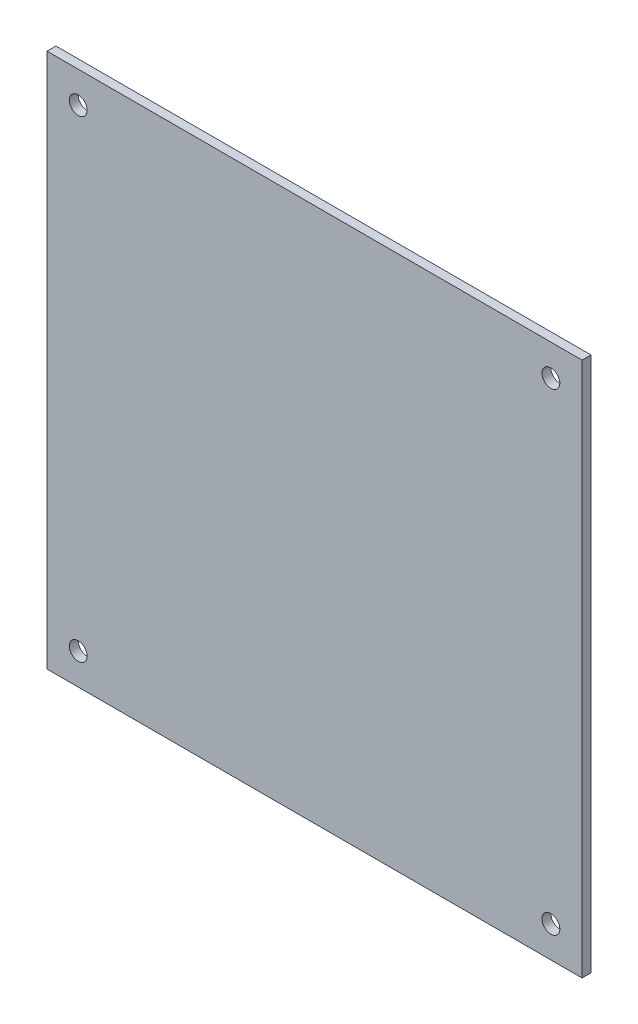
ISO-10303-21;
HEADER;
FILE_DESCRIPTION(('STEP AP214'),'2;1');
FILE_NAME('part.step','',(''),(''),'','','');
FILE_SCHEMA(('AUTOMOTIVE_DESIGN { 1 0 10303 214 1 1 1 1 }'));
ENDSEC;
DATA;
#1=APPLICATION_CONTEXT('core data for automotive mechanical design processes');
#2=APPLICATION_PROTOCOL_DEFINITION('international standard','automotive_design',2000,#1);
#3=PRODUCT_CONTEXT('',#1,'mechanical');
#4=PRODUCT('Part','Part','',(#3));
#5=PRODUCT_RELATED_PRODUCT_CATEGORY('part','',(#4));
#6=PRODUCT_DEFINITION_FORMATION('','',#4);
#7=PRODUCT_DEFINITION_CONTEXT('part definition',#1,'design');
#8=PRODUCT_DEFINITION('design','',#6,#7);
#9=PRODUCT_DEFINITION_SHAPE('','',#8);
#10=(LENGTH_UNIT() NAMED_UNIT(*) SI_UNIT(.MILLI.,.METRE.));
#11=(NAMED_UNIT(*) PLANE_ANGLE_UNIT() SI_UNIT($,.RADIAN.));
#12=(NAMED_UNIT(*) SI_UNIT($,.STERADIAN.) SOLID_ANGLE_UNIT());
#13=UNCERTAINTY_MEASURE_WITH_UNIT(LENGTH_MEASURE(1.E-05),#10,'distance_accuracy_value','');
#14=(GEOMETRIC_REPRESENTATION_CONTEXT(3) GLOBAL_UNCERTAINTY_ASSIGNED_CONTEXT((#13)) GLOBAL_UNIT_ASSIGNED_CONTEXT((#10,
#11,#12)) REPRESENTATION_CONTEXT('',''));
#15=CARTESIAN_POINT('',(0.,0.,0.));
#16=DIRECTION('',(0.,0.,1.));
#17=DIRECTION('',(1.,0.,0.));
#18=AXIS2_PLACEMENT_3D('',#15,#16,#17);
#19=CARTESIAN_POINT('',(0.,0.,4.99999999999999));
#20=DIRECTION('',(0.,0.,-1.));
#21=DIRECTION('',(-1.,0.,0.));
#22=AXIS2_PLACEMENT_3D('',#19,#20,#21);
#23=PLANE('',#22);
#24=DIRECTION('',(0.,1.,0.));
#25=VECTOR('',#24,1.);
#26=CARTESIAN_POINT('',(137.454954954955,81.0135135135139,4.99999999999999));
#27=LINE('',#26,#25);
#28=CARTESIAN_POINT('',(137.454954954955,-218.986486486487,4.99999999999999));
#29=VERTEX_POINT('',#28);
#30=CARTESIAN_POINT('',(137.454954954955,81.0135135135139,4.99999999999999));
#31=VERTEX_POINT('',#30);
#32=EDGE_CURVE('E84',#29,#31,#27,.T.);
#33=ORIENTED_EDGE('',*,*,#32,.T.);
#34=DIRECTION('',(-1.,0.,0.));
#35=VECTOR('',#34,1.);
#36=CARTESIAN_POINT('',(137.454954954955,81.0135135135139,4.99999999999999));
#37=LINE('',#36,#35);
#38=CARTESIAN_POINT('',(-162.545045045045,81.0135135135139,4.99999999999999));
#39=VERTEX_POINT('',#38);
#40=EDGE_CURVE('E79',#31,#39,#37,.T.);
#41=ORIENTED_EDGE('',*,*,#40,.T.);
#42=DIRECTION('',(0.,-1.,0.));
#43=VECTOR('',#42,1.);
#44=CARTESIAN_POINT('',(-162.545045045045,81.0135135135139,4.99999999999999));
#45=LINE('',#44,#43);
#46=CARTESIAN_POINT('',(-162.545045045045,-218.986486486487,4.99999999999999));
#47=VERTEX_POINT('',#46);
#48=EDGE_CURVE('E82',#39,#47,#45,.T.);
#49=ORIENTED_EDGE('',*,*,#48,.T.);
#50=DIRECTION('',(1.,0.,0.));
#51=VECTOR('',#50,1.);
#52=CARTESIAN_POINT('',(137.454954954955,-218.986486486487,4.99999999999999));
#53=LINE('',#52,#51);
#54=EDGE_CURVE('E49',#47,#29,#53,.T.);
#55=ORIENTED_EDGE('',*,*,#54,.T.);
#56=EDGE_LOOP('',(#33,#41,#49,#55));
#57=FACE_BOUND('',#56,.T.);
#58=CARTESIAN_POINT('',(-145.045045045045,63.513513513513,5.));
#59=DIRECTION('',(0.,0.,1.));
#60=DIRECTION('',(1.,0.,0.));
#61=AXIS2_PLACEMENT_3D('',#58,#59,#60);
#62=CIRCLE('',#61,4.99999999999999);
#63=CARTESIAN_POINT('',(-140.045045045045,63.513513513513,5.));
#64=VERTEX_POINT('',#63);
#65=EDGE_CURVE('E99',#64,#64,#62,.T.);
#66=ORIENTED_EDGE('',*,*,#65,.F.);
#67=EDGE_LOOP('',(#66));
#68=FACE_BOUND('',#67,.T.);
#69=CARTESIAN_POINT('',(119.954954954955,63.513513513513,5.));
#70=DIRECTION('',(0.,0.,1.));
#71=DIRECTION('',(1.,0.,0.));
#72=AXIS2_PLACEMENT_3D('',#69,#70,#71);
#73=CIRCLE('',#72,5.00000000000001);
#74=CARTESIAN_POINT('',(124.954954954955,63.513513513513,5.));
#75=VERTEX_POINT('',#74);
#76=EDGE_CURVE('E114',#75,#75,#73,.T.);
#77=ORIENTED_EDGE('',*,*,#76,.F.);
#78=EDGE_LOOP('',(#77));
#79=FACE_BOUND('',#78,.T.);
#80=CARTESIAN_POINT('',(119.954954954955,-201.486486486487,5.));
#81=DIRECTION('',(0.,0.,1.));
#82=DIRECTION('',(1.,0.,0.));
#83=AXIS2_PLACEMENT_3D('',#80,#81,#82);
#84=CIRCLE('',#83,5.00000000000001);
#85=CARTESIAN_POINT('',(124.954954954955,-201.486486486487,5.));
#86=VERTEX_POINT('',#85);
#87=EDGE_CURVE('E120',#86,#86,#84,.T.);
#88=ORIENTED_EDGE('',*,*,#87,.F.);
#89=EDGE_LOOP('',(#88));
#90=FACE_BOUND('',#89,.T.);
#91=CARTESIAN_POINT('',(-145.045045045045,-201.486486486487,5.));
#92=DIRECTION('',(0.,0.,1.));
#93=DIRECTION('',(1.,0.,0.));
#94=AXIS2_PLACEMENT_3D('',#91,#92,#93);
#95=CIRCLE('',#94,4.99999999999999);
#96=CARTESIAN_POINT('',(-140.045045045045,-201.486486486487,5.));
#97=VERTEX_POINT('',#96);
#98=EDGE_CURVE('E126',#97,#97,#95,.T.);
#99=ORIENTED_EDGE('',*,*,#98,.F.);
#100=EDGE_LOOP('',(#99));
#101=FACE_BOUND('',#100,.T.);
#102=ADVANCED_FACE('F32',(#57,#68,#79,#90,#101),#23,.F.);
#103=CARTESIAN_POINT('',(0.,0.,0.));
#104=DIRECTION('',(0.,0.,-1.));
#105=DIRECTION('',(-1.,0.,0.));
#106=AXIS2_PLACEMENT_3D('',#103,#104,#105);
#107=PLANE('',#106);
#108=CARTESIAN_POINT('',(119.954954954955,-201.486486486487,0.));
#109=DIRECTION('',(0.,0.,1.));
#110=DIRECTION('',(1.,0.,0.));
#111=AXIS2_PLACEMENT_3D('',#108,#109,#110);
#112=CIRCLE('',#111,5.00000000000001);
#113=CARTESIAN_POINT('',(124.954954954955,-201.486486486487,0.));
#114=VERTEX_POINT('',#113);
#115=EDGE_CURVE('E123',#114,#114,#112,.T.);
#116=ORIENTED_EDGE('',*,*,#115,.T.);
#117=EDGE_LOOP('',(#116));
#118=FACE_BOUND('',#117,.T.);
#119=CARTESIAN_POINT('',(-145.045045045045,63.513513513513,0.));
#120=DIRECTION('',(0.,0.,1.));
#121=DIRECTION('',(1.,0.,0.));
#122=AXIS2_PLACEMENT_3D('',#119,#120,#121);
#123=CIRCLE('',#122,4.99999999999999);
#124=CARTESIAN_POINT('',(-140.045045045045,63.513513513513,0.));
#125=VERTEX_POINT('',#124);
#126=EDGE_CURVE('E111',#125,#125,#123,.T.);
#127=ORIENTED_EDGE('',*,*,#126,.T.);
#128=EDGE_LOOP('',(#127));
#129=FACE_BOUND('',#128,.T.);
#130=DIRECTION('',(0.,1.,0.));
#131=VECTOR('',#130,1.);
#132=CARTESIAN_POINT('',(137.454954954955,81.013513513513,0.));
#133=LINE('',#132,#131);
#134=CARTESIAN_POINT('',(137.454954954955,-218.986486486487,0.));
#135=VERTEX_POINT('',#134);
#136=CARTESIAN_POINT('',(137.454954954955,81.013513513513,0.));
#137=VERTEX_POINT('',#136);
#138=EDGE_CURVE('E96',#135,#137,#133,.T.);
#139=ORIENTED_EDGE('',*,*,#138,.F.);
#140=DIRECTION('',(1.,0.,0.));
#141=VECTOR('',#140,1.);
#142=CARTESIAN_POINT('',(137.454954954955,-218.986486486487,0.));
#143=LINE('',#142,#141);
#144=CARTESIAN_POINT('',(-162.545045045045,-218.986486486488,0.));
#145=VERTEX_POINT('',#144);
#146=EDGE_CURVE('E72',#145,#135,#143,.T.);
#147=ORIENTED_EDGE('',*,*,#146,.F.);
#148=DIRECTION('',(0.,-1.,0.));
#149=VECTOR('',#148,1.);
#150=CARTESIAN_POINT('',(-162.545045045045,81.013513513513,0.));
#151=LINE('',#150,#149);
#152=CARTESIAN_POINT('',(-162.545045045045,81.013513513513,0.));
#153=VERTEX_POINT('',#152);
#154=EDGE_CURVE('E66',#153,#145,#151,.T.);
#155=ORIENTED_EDGE('',*,*,#154,.F.);
#156=DIRECTION('',(-1.,0.,0.));
#157=VECTOR('',#156,1.);
#158=CARTESIAN_POINT('',(137.454954954955,81.013513513513,0.));
#159=LINE('',#158,#157);
#160=EDGE_CURVE('E88',#137,#153,#159,.T.);
#161=ORIENTED_EDGE('',*,*,#160,.F.);
#162=EDGE_LOOP('',(#139,#147,#155,#161));
#163=FACE_BOUND('',#162,.T.);
#164=CARTESIAN_POINT('',(119.954954954955,63.513513513513,0.));
#165=DIRECTION('',(0.,0.,1.));
#166=DIRECTION('',(1.,0.,0.));
#167=AXIS2_PLACEMENT_3D('',#164,#165,#166);
#168=CIRCLE('',#167,5.00000000000001);
#169=CARTESIAN_POINT('',(124.954954954955,63.513513513513,0.));
#170=VERTEX_POINT('',#169);
#171=EDGE_CURVE('E117',#170,#170,#168,.T.);
#172=ORIENTED_EDGE('',*,*,#171,.T.);
#173=EDGE_LOOP('',(#172));
#174=FACE_BOUND('',#173,.T.);
#175=CARTESIAN_POINT('',(-145.045045045045,-201.486486486487,0.));
#176=DIRECTION('',(0.,0.,1.));
#177=DIRECTION('',(1.,0.,0.));
#178=AXIS2_PLACEMENT_3D('',#175,#176,#177);
#179=CIRCLE('',#178,4.99999999999999);
#180=CARTESIAN_POINT('',(-140.045045045045,-201.486486486487,0.));
#181=VERTEX_POINT('',#180);
#182=EDGE_CURVE('E129',#181,#181,#179,.T.);
#183=ORIENTED_EDGE('',*,*,#182,.T.);
#184=EDGE_LOOP('',(#183));
#185=FACE_BOUND('',#184,.T.);
#186=ADVANCED_FACE('F107',(#118,#129,#163,#174,#185),#107,.T.);
#187=CARTESIAN_POINT('',(137.454954954955,81.0135135135139,4.99999999999999));
#188=DIRECTION('',(-1.,0.,0.));
#189=DIRECTION('',(0.,-1.,0.));
#190=AXIS2_PLACEMENT_3D('',#187,#188,#189);
#191=PLANE('',#190);
#192=ORIENTED_EDGE('',*,*,#138,.T.);
#193=DIRECTION('',(0.,0.,-1.));
#194=VECTOR('',#193,1.);
#195=CARTESIAN_POINT('',(137.454954954955,81.0135135135139,4.99999999999999));
#196=LINE('',#195,#194);
#197=EDGE_CURVE('E11',#31,#137,#196,.T.);
#198=ORIENTED_EDGE('',*,*,#197,.F.);
#199=ORIENTED_EDGE('',*,*,#32,.F.);
#200=DIRECTION('',(0.,0.,-1.));
#201=VECTOR('',#200,1.);
#202=CARTESIAN_POINT('',(137.454954954955,-218.986486486487,4.99999999999999));
#203=LINE('',#202,#201);
#204=EDGE_CURVE('E92',#29,#135,#203,.T.);
#205=ORIENTED_EDGE('',*,*,#204,.T.);
#206=EDGE_LOOP('',(#192,#198,#199,#205));
#207=FACE_BOUND('',#206,.T.);
#208=ADVANCED_FACE('F34',(#207),#191,.F.);
#209=CARTESIAN_POINT('',(137.454954954955,81.0135135135139,4.99999999999999));
#210=DIRECTION('',(0.,-1.,0.));
#211=DIRECTION('',(1.,0.,0.));
#212=AXIS2_PLACEMENT_3D('',#209,#210,#211);
#213=PLANE('',#212);
#214=ORIENTED_EDGE('',*,*,#160,.T.);
#215=DIRECTION('',(0.,0.,-1.));
#216=VECTOR('',#215,1.);
#217=CARTESIAN_POINT('',(-162.545045045045,81.0135135135139,4.99999999999999));
#218=LINE('',#217,#216);
#219=EDGE_CURVE('E41',#39,#153,#218,.T.);
#220=ORIENTED_EDGE('',*,*,#219,.F.);
#221=ORIENTED_EDGE('',*,*,#40,.F.);
#222=ORIENTED_EDGE('',*,*,#197,.T.);
#223=EDGE_LOOP('',(#214,#220,#221,#222));
#224=FACE_BOUND('',#223,.T.);
#225=ADVANCED_FACE('F87',(#224),#213,.F.);
#226=CARTESIAN_POINT('',(-162.545045045045,81.0135135135139,4.99999999999999));
#227=DIRECTION('',(1.,0.,0.));
#228=DIRECTION('',(0.,1.,0.));
#229=AXIS2_PLACEMENT_3D('',#226,#227,#228);
#230=PLANE('',#229);
#231=ORIENTED_EDGE('',*,*,#154,.T.);
#232=DIRECTION('',(0.,0.,-1.));
#233=VECTOR('',#232,1.);
#234=CARTESIAN_POINT('',(-162.545045045045,-218.986486486487,4.99999999999999));
#235=LINE('',#234,#233);
#236=EDGE_CURVE('E89',#47,#145,#235,.T.);
#237=ORIENTED_EDGE('',*,*,#236,.F.);
#238=ORIENTED_EDGE('',*,*,#48,.F.);
#239=ORIENTED_EDGE('',*,*,#219,.T.);
#240=EDGE_LOOP('',(#231,#237,#238,#239));
#241=FACE_BOUND('',#240,.T.);
#242=ADVANCED_FACE('F90',(#241),#230,.F.);
#243=CARTESIAN_POINT('',(137.454954954955,-218.986486486487,4.99999999999999));
#244=DIRECTION('',(0.,1.,0.));
#245=DIRECTION('',(-1.,0.,0.));
#246=AXIS2_PLACEMENT_3D('',#243,#244,#245);
#247=PLANE('',#246);
#248=ORIENTED_EDGE('',*,*,#146,.T.);
#249=ORIENTED_EDGE('',*,*,#204,.F.);
#250=ORIENTED_EDGE('',*,*,#54,.F.);
#251=ORIENTED_EDGE('',*,*,#236,.T.);
#252=EDGE_LOOP('',(#248,#249,#250,#251));
#253=FACE_BOUND('',#252,.T.);
#254=ADVANCED_FACE('F104',(#253),#247,.F.);
#255=CARTESIAN_POINT('',(-145.045045045045,63.513513513513,5.));
#256=DIRECTION('',(0.,0.,-1.));
#257=DIRECTION('',(-1.,0.,0.));
#258=AXIS2_PLACEMENT_3D('',#255,#256,#257);
#259=CYLINDRICAL_SURFACE('',#258,4.99999999999999);
#260=ORIENTED_EDGE('',*,*,#65,.T.);
#261=EDGE_LOOP('',(#260));
#262=FACE_BOUND('',#261,.T.);
#263=ORIENTED_EDGE('',*,*,#126,.F.);
#264=EDGE_LOOP('',(#263));
#265=FACE_BOUND('',#264,.T.);
#266=ADVANCED_FACE('F146',(#262,#265),#259,.F.);
#267=CARTESIAN_POINT('',(119.954954954955,63.513513513513,5.));
#268=DIRECTION('',(0.,0.,-1.));
#269=DIRECTION('',(-1.,0.,0.));
#270=AXIS2_PLACEMENT_3D('',#267,#268,#269);
#271=CYLINDRICAL_SURFACE('',#270,5.00000000000001);
#272=ORIENTED_EDGE('',*,*,#76,.T.);
#273=EDGE_LOOP('',(#272));
#274=FACE_BOUND('',#273,.T.);
#275=ORIENTED_EDGE('',*,*,#171,.F.);
#276=EDGE_LOOP('',(#275));
#277=FACE_BOUND('',#276,.T.);
#278=ADVANCED_FACE('F192',(#274,#277),#271,.F.);
#279=CARTESIAN_POINT('',(119.954954954955,-201.486486486487,5.));
#280=DIRECTION('',(0.,0.,-1.));
#281=DIRECTION('',(-1.,0.,0.));
#282=AXIS2_PLACEMENT_3D('',#279,#280,#281);
#283=CYLINDRICAL_SURFACE('',#282,5.00000000000001);
#284=ORIENTED_EDGE('',*,*,#87,.T.);
#285=EDGE_LOOP('',(#284));
#286=FACE_BOUND('',#285,.T.);
#287=ORIENTED_EDGE('',*,*,#115,.F.);
#288=EDGE_LOOP('',(#287));
#289=FACE_BOUND('',#288,.T.);
#290=ADVANCED_FACE('F200',(#286,#289),#283,.F.);
#291=CARTESIAN_POINT('',(-145.045045045045,-201.486486486487,5.));
#292=DIRECTION('',(0.,0.,-1.));
#293=DIRECTION('',(-1.,0.,0.));
#294=AXIS2_PLACEMENT_3D('',#291,#292,#293);
#295=CYLINDRICAL_SURFACE('',#294,4.99999999999999);
#296=ORIENTED_EDGE('',*,*,#98,.T.);
#297=EDGE_LOOP('',(#296));
#298=FACE_BOUND('',#297,.T.);
#299=ORIENTED_EDGE('',*,*,#182,.F.);
#300=EDGE_LOOP('',(#299));
#301=FACE_BOUND('',#300,.T.);
#302=ADVANCED_FACE('F135',(#298,#301),#295,.F.);
#303=CLOSED_SHELL('',(#102,#186,#208,#225,#242,#254,#266,#278,#290,#302));
#304=MANIFOLD_SOLID_BREP('B2',#303);
#305=ADVANCED_BREP_SHAPE_REPRESENTATION('',(#18,#304),#14);
#306=SHAPE_DEFINITION_REPRESENTATION(#9,#305);
ENDSEC;
END-ISO-10303-21;
